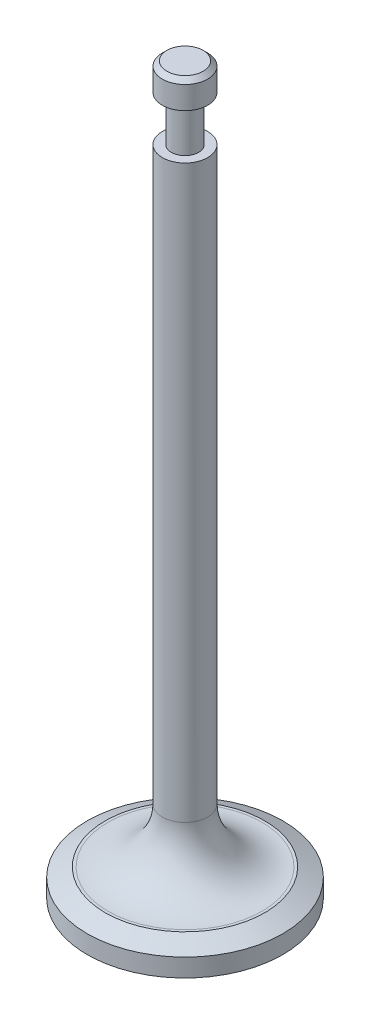
ISO-10303-21;
HEADER;
FILE_DESCRIPTION(('STEP AP214'),'2;1');
FILE_NAME('part.step','',(''),(''),'','','');
FILE_SCHEMA(('AUTOMOTIVE_DESIGN { 1 0 10303 214 1 1 1 1 }'));
ENDSEC;
DATA;
#1=APPLICATION_CONTEXT('core data for automotive mechanical design processes');
#2=APPLICATION_PROTOCOL_DEFINITION('international standard','automotive_design',2000,#1);
#3=PRODUCT_CONTEXT('',#1,'mechanical');
#4=PRODUCT('Part','Part','',(#3));
#5=PRODUCT_RELATED_PRODUCT_CATEGORY('part','',(#4));
#6=PRODUCT_DEFINITION_FORMATION('','',#4);
#7=PRODUCT_DEFINITION_CONTEXT('part definition',#1,'design');
#8=PRODUCT_DEFINITION('design','',#6,#7);
#9=PRODUCT_DEFINITION_SHAPE('','',#8);
#10=(LENGTH_UNIT() NAMED_UNIT(*) SI_UNIT(.MILLI.,.METRE.));
#11=(NAMED_UNIT(*) PLANE_ANGLE_UNIT() SI_UNIT($,.RADIAN.));
#12=(NAMED_UNIT(*) SI_UNIT($,.STERADIAN.) SOLID_ANGLE_UNIT());
#13=UNCERTAINTY_MEASURE_WITH_UNIT(LENGTH_MEASURE(1.E-05),#10,'distance_accuracy_value','');
#14=(GEOMETRIC_REPRESENTATION_CONTEXT(3) GLOBAL_UNCERTAINTY_ASSIGNED_CONTEXT((#13)) GLOBAL_UNIT_ASSIGNED_CONTEXT((#10,
#11,#12)) REPRESENTATION_CONTEXT('',''));
#15=CARTESIAN_POINT('',(0.,0.,0.));
#16=DIRECTION('',(0.,0.,1.));
#17=DIRECTION('',(1.,0.,0.));
#18=AXIS2_PLACEMENT_3D('',#15,#16,#17);
#19=CARTESIAN_POINT('',(10.7930501353852,0.,0.));
#20=DIRECTION('',(0.,-1.,0.));
#21=DIRECTION('',(0.,0.,-1.));
#22=AXIS2_PLACEMENT_3D('',#19,#20,#21);
#23=PLANE('',#22);
#24=CARTESIAN_POINT('',(0.,0.,0.));
#25=DIRECTION('',(0.,-1.,0.));
#26=DIRECTION('',(0.,0.,-1.));
#27=AXIS2_PLACEMENT_3D('',#24,#25,#26);
#28=CIRCLE('',#27,10.7930501353852);
#29=CARTESIAN_POINT('',(0.,0.,-10.7930501353852));
#30=VERTEX_POINT('',#29);
#31=EDGE_CURVE('E77',#30,#30,#28,.T.);
#32=ORIENTED_EDGE('',*,*,#31,.T.);
#33=EDGE_LOOP('',(#32));
#34=FACE_BOUND('',#33,.T.);
#35=ADVANCED_FACE('F39',(#34),#23,.T.);
#36=CARTESIAN_POINT('',(0.,80.,0.));
#37=DIRECTION('',(0.,1.,0.));
#38=DIRECTION('',(0.,0.,1.));
#39=AXIS2_PLACEMENT_3D('',#36,#37,#38);
#40=PLANE('',#39);
#41=CARTESIAN_POINT('',(0.,80.,0.));
#42=DIRECTION('',(0.,1.,0.));
#43=DIRECTION('',(0.,0.,1.));
#44=AXIS2_PLACEMENT_3D('',#41,#42,#43);
#45=CIRCLE('',#44,2.00000000000001);
#46=CARTESIAN_POINT('',(0.,80.,2.00000000000001));
#47=VERTEX_POINT('',#46);
#48=EDGE_CURVE('E51',#47,#47,#45,.T.);
#49=ORIENTED_EDGE('',*,*,#48,.T.);
#50=EDGE_LOOP('',(#49));
#51=FACE_BOUND('',#50,.T.);
#52=ADVANCED_FACE('F97',(#51),#40,.T.);
#53=CARTESIAN_POINT('',(0.,0.,0.));
#54=DIRECTION('',(0.,-1.,0.));
#55=DIRECTION('',(0.,0.,-1.));
#56=AXIS2_PLACEMENT_3D('',#53,#54,#55);
#57=CYLINDRICAL_SURFACE('',#56,2.5);
#58=CARTESIAN_POINT('',(0.,79.5,0.));
#59=DIRECTION('',(0.,1.,0.));
#60=DIRECTION('',(0.,0.,1.));
#61=AXIS2_PLACEMENT_3D('',#58,#59,#60);
#62=CIRCLE('',#61,2.5);
#63=CARTESIAN_POINT('',(0.,79.5,2.5));
#64=VERTEX_POINT('',#63);
#65=EDGE_CURVE('E54',#64,#64,#62,.F.);
#66=ORIENTED_EDGE('',*,*,#65,.T.);
#67=EDGE_LOOP('',(#66));
#68=FACE_BOUND('',#67,.T.);
#69=CARTESIAN_POINT('',(0.,77.,0.));
#70=DIRECTION('',(0.,-1.,0.));
#71=DIRECTION('',(0.,0.,-1.));
#72=AXIS2_PLACEMENT_3D('',#69,#70,#71);
#73=CIRCLE('',#72,2.5);
#74=CARTESIAN_POINT('',(0.,77.,-2.5));
#75=VERTEX_POINT('',#74);
#76=EDGE_CURVE('E68',#75,#75,#73,.T.);
#77=ORIENTED_EDGE('',*,*,#76,.F.);
#78=EDGE_LOOP('',(#77));
#79=FACE_BOUND('',#78,.T.);
#80=ADVANCED_FACE('F104',(#68,#79),#57,.T.);
#81=CARTESIAN_POINT('',(2.5,77.,0.));
#82=DIRECTION('',(0.,-1.,0.));
#83=DIRECTION('',(0.,0.,-1.));
#84=AXIS2_PLACEMENT_3D('',#81,#82,#83);
#85=PLANE('',#84);
#86=ORIENTED_EDGE('',*,*,#76,.T.);
#87=EDGE_LOOP('',(#86));
#88=FACE_BOUND('',#87,.T.);
#89=CARTESIAN_POINT('',(0.,77.,0.));
#90=DIRECTION('',(0.,-1.,0.));
#91=DIRECTION('',(0.,0.,-1.));
#92=AXIS2_PLACEMENT_3D('',#89,#90,#91);
#93=CIRCLE('',#92,1.5);
#94=CARTESIAN_POINT('',(0.,77.,-1.5));
#95=VERTEX_POINT('',#94);
#96=EDGE_CURVE('E69',#95,#95,#93,.T.);
#97=ORIENTED_EDGE('',*,*,#96,.F.);
#98=EDGE_LOOP('',(#97));
#99=FACE_BOUND('',#98,.T.);
#100=ADVANCED_FACE('F121',(#88,#99),#85,.T.);
#101=CARTESIAN_POINT('',(0.,0.,0.));
#102=DIRECTION('',(0.,-1.,0.));
#103=DIRECTION('',(0.,0.,-1.));
#104=AXIS2_PLACEMENT_3D('',#101,#102,#103);
#105=CYLINDRICAL_SURFACE('',#104,1.5);
#106=ORIENTED_EDGE('',*,*,#96,.T.);
#107=EDGE_LOOP('',(#106));
#108=FACE_BOUND('',#107,.T.);
#109=CARTESIAN_POINT('',(0.,72.,0.));
#110=DIRECTION('',(0.,-1.,0.));
#111=DIRECTION('',(0.,0.,-1.));
#112=AXIS2_PLACEMENT_3D('',#109,#110,#111);
#113=CIRCLE('',#112,1.5);
#114=CARTESIAN_POINT('',(0.,72.,-1.5));
#115=VERTEX_POINT('',#114);
#116=EDGE_CURVE('E75',#115,#115,#113,.T.);
#117=ORIENTED_EDGE('',*,*,#116,.F.);
#118=EDGE_LOOP('',(#117));
#119=FACE_BOUND('',#118,.T.);
#120=ADVANCED_FACE('F130',(#108,#119),#105,.T.);
#121=CARTESIAN_POINT('',(1.5,72.,0.));
#122=DIRECTION('',(0.,1.,0.));
#123=DIRECTION('',(0.,0.,1.));
#124=AXIS2_PLACEMENT_3D('',#121,#122,#123);
#125=PLANE('',#124);
#126=ORIENTED_EDGE('',*,*,#116,.T.);
#127=EDGE_LOOP('',(#126));
#128=FACE_BOUND('',#127,.T.);
#129=CARTESIAN_POINT('',(0.,72.,0.));
#130=DIRECTION('',(0.,-1.,0.));
#131=DIRECTION('',(0.,0.,-1.));
#132=AXIS2_PLACEMENT_3D('',#129,#130,#131);
#133=CIRCLE('',#132,2.5);
#134=CARTESIAN_POINT('',(0.,72.,-2.5));
#135=VERTEX_POINT('',#134);
#136=EDGE_CURVE('E73',#135,#135,#133,.T.);
#137=ORIENTED_EDGE('',*,*,#136,.F.);
#138=EDGE_LOOP('',(#137));
#139=FACE_BOUND('',#138,.T.);
#140=ADVANCED_FACE('F132',(#128,#139),#125,.T.);
#141=CARTESIAN_POINT('',(0.,0.,0.));
#142=DIRECTION('',(0.,-1.,0.));
#143=DIRECTION('',(0.,0.,-1.));
#144=AXIS2_PLACEMENT_3D('',#141,#142,#143);
#145=CYLINDRICAL_SURFACE('',#144,2.5);
#146=CARTESIAN_POINT('',(0.,9.,0.));
#147=DIRECTION('',(0.,1.,0.));
#148=DIRECTION('',(0.,0.,1.));
#149=AXIS2_PLACEMENT_3D('',#146,#147,#148);
#150=CIRCLE('',#149,2.5);
#151=CARTESIAN_POINT('',(0.,9.,2.5));
#152=VERTEX_POINT('',#151);
#153=EDGE_CURVE('E58',#152,#152,#150,.T.);
#154=ORIENTED_EDGE('',*,*,#153,.T.);
#155=EDGE_LOOP('',(#154));
#156=FACE_BOUND('',#155,.T.);
#157=ORIENTED_EDGE('',*,*,#136,.T.);
#158=EDGE_LOOP('',(#157));
#159=FACE_BOUND('',#158,.T.);
#160=ADVANCED_FACE('F96',(#156,#159),#145,.T.);
#161=CARTESIAN_POINT('',(2.50000000000001,3.,0.));
#162=DIRECTION('',(0.,1.,0.));
#163=DIRECTION('',(0.,0.,1.));
#164=AXIS2_PLACEMENT_3D('',#161,#162,#163);
#165=PLANE('',#164);
#166=CARTESIAN_POINT('',(0.,3.,0.));
#167=DIRECTION('',(0.,1.,0.));
#168=DIRECTION('',(0.,0.,1.));
#169=AXIS2_PLACEMENT_3D('',#166,#167,#168);
#170=CIRCLE('',#169,8.79305013538517);
#171=CARTESIAN_POINT('',(0.,3.,8.79305013538517));
#172=VERTEX_POINT('',#171);
#173=EDGE_CURVE('E10',#172,#172,#170,.T.);
#174=ORIENTED_EDGE('',*,*,#173,.T.);
#175=EDGE_LOOP('',(#174));
#176=FACE_BOUND('',#175,.T.);
#177=CARTESIAN_POINT('',(0.,3.,0.));
#178=DIRECTION('',(0.,1.,0.));
#179=DIRECTION('',(0.,0.,1.));
#180=AXIS2_PLACEMENT_3D('',#177,#178,#179);
#181=CIRCLE('',#180,8.5);
#182=CARTESIAN_POINT('',(0.,3.,8.5));
#183=VERTEX_POINT('',#182);
#184=EDGE_CURVE('E62',#183,#183,#181,.F.);
#185=ORIENTED_EDGE('',*,*,#184,.T.);
#186=EDGE_LOOP('',(#185));
#187=FACE_BOUND('',#186,.T.);
#188=ADVANCED_FACE('F88',(#176,#187),#165,.T.);
#189=CARTESIAN_POINT('',(0.,0.,0.));
#190=DIRECTION('',(0.,-1.,0.));
#191=DIRECTION('',(0.,0.,-1.));
#192=AXIS2_PLACEMENT_3D('',#189,#190,#191);
#193=CYLINDRICAL_SURFACE('',#192,10.7930501353852);
#194=CARTESIAN_POINT('',(0.,1.99999999999999,0.));
#195=DIRECTION('',(0.,1.,0.));
#196=DIRECTION('',(0.,0.,1.));
#197=AXIS2_PLACEMENT_3D('',#194,#195,#196);
#198=CIRCLE('',#197,10.7930501353852);
#199=CARTESIAN_POINT('',(0.,1.99999999999999,10.7930501353852));
#200=VERTEX_POINT('',#199);
#201=EDGE_CURVE('E50',#200,#200,#198,.F.);
#202=ORIENTED_EDGE('',*,*,#201,.T.);
#203=EDGE_LOOP('',(#202));
#204=FACE_BOUND('',#203,.T.);
#205=ORIENTED_EDGE('',*,*,#31,.F.);
#206=EDGE_LOOP('',(#205));
#207=FACE_BOUND('',#206,.T.);
#208=ADVANCED_FACE('F81',(#204,#207),#193,.T.);
#209=CARTESIAN_POINT('',(0.,9.,0.));
#210=DIRECTION('',(0.,1.,0.));
#211=DIRECTION('',(0.,0.,1.));
#212=AXIS2_PLACEMENT_3D('',#209,#210,#211);
#213=TOROIDAL_SURFACE('',#212,8.5,6.);
#214=ORIENTED_EDGE('',*,*,#153,.F.);
#215=EDGE_LOOP('',(#214));
#216=FACE_BOUND('',#215,.T.);
#217=ORIENTED_EDGE('',*,*,#184,.F.);
#218=EDGE_LOOP('',(#217));
#219=FACE_BOUND('',#218,.T.);
#220=ADVANCED_FACE('F82',(#216,#219),#213,.F.);
#221=CARTESIAN_POINT('',(0.,79.5,0.));
#222=DIRECTION('',(0.,-1.,0.));
#223=DIRECTION('',(0.,0.,-1.));
#224=AXIS2_PLACEMENT_3D('',#221,#222,#223);
#225=CONICAL_SURFACE('',#224,2.5,0.785398163397453);
#226=ORIENTED_EDGE('',*,*,#48,.F.);
#227=EDGE_LOOP('',(#226));
#228=FACE_BOUND('',#227,.T.);
#229=ORIENTED_EDGE('',*,*,#65,.F.);
#230=EDGE_LOOP('',(#229));
#231=FACE_BOUND('',#230,.T.);
#232=ADVANCED_FACE('F91',(#228,#231),#225,.T.);
#233=CARTESIAN_POINT('',(0.,1.99999999999999,0.));
#234=DIRECTION('',(0.,-1.,0.));
#235=DIRECTION('',(0.,0.,-1.));
#236=AXIS2_PLACEMENT_3D('',#233,#234,#235);
#237=CONICAL_SURFACE('',#236,10.7930501353852,1.10714871779409);
#238=ORIENTED_EDGE('',*,*,#173,.F.);
#239=EDGE_LOOP('',(#238));
#240=FACE_BOUND('',#239,.T.);
#241=ORIENTED_EDGE('',*,*,#201,.F.);
#242=EDGE_LOOP('',(#241));
#243=FACE_BOUND('',#242,.T.);
#244=ADVANCED_FACE('F45',(#240,#243),#237,.T.);
#245=CLOSED_SHELL('',(#35,#52,#80,#100,#120,#140,#160,#188,#208,#220,#232,#244));
#246=MANIFOLD_SOLID_BREP('B2',#245);
#247=ADVANCED_BREP_SHAPE_REPRESENTATION('',(#18,#246),#14);
#248=SHAPE_DEFINITION_REPRESENTATION(#9,#247);
ENDSEC;
END-ISO-10303-21;
